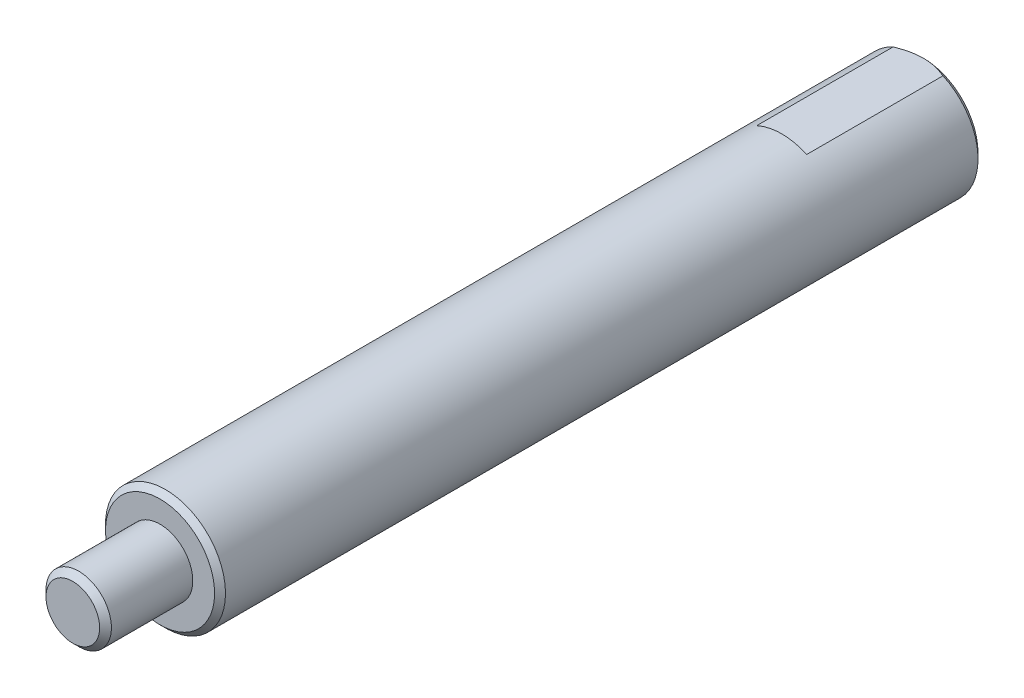
ISO-10303-21;
HEADER;
FILE_DESCRIPTION(('STEP AP214'),'2;1');
FILE_NAME('part.step','',(''),(''),'','','');
FILE_SCHEMA(('AUTOMOTIVE_DESIGN { 1 0 10303 214 1 1 1 1 }'));
ENDSEC;
DATA;
#1=APPLICATION_CONTEXT('core data for automotive mechanical design processes');
#2=APPLICATION_PROTOCOL_DEFINITION('international standard','automotive_design',2000,#1);
#3=PRODUCT_CONTEXT('',#1,'mechanical');
#4=PRODUCT('Part','Part','',(#3));
#5=PRODUCT_RELATED_PRODUCT_CATEGORY('part','',(#4));
#6=PRODUCT_DEFINITION_FORMATION('','',#4);
#7=PRODUCT_DEFINITION_CONTEXT('part definition',#1,'design');
#8=PRODUCT_DEFINITION('design','',#6,#7);
#9=PRODUCT_DEFINITION_SHAPE('','',#8);
#10=(LENGTH_UNIT() NAMED_UNIT(*) SI_UNIT(.MILLI.,.METRE.));
#11=(NAMED_UNIT(*) PLANE_ANGLE_UNIT() SI_UNIT($,.RADIAN.));
#12=(NAMED_UNIT(*) SI_UNIT($,.STERADIAN.) SOLID_ANGLE_UNIT());
#13=UNCERTAINTY_MEASURE_WITH_UNIT(LENGTH_MEASURE(1.E-05),#10,'distance_accuracy_value','');
#14=(GEOMETRIC_REPRESENTATION_CONTEXT(3) GLOBAL_UNCERTAINTY_ASSIGNED_CONTEXT((#13)) GLOBAL_UNIT_ASSIGNED_CONTEXT((#10,
#11,#12)) REPRESENTATION_CONTEXT('',''));
#15=CARTESIAN_POINT('',(0.,0.,0.));
#16=DIRECTION('',(0.,0.,1.));
#17=DIRECTION('',(1.,0.,0.));
#18=AXIS2_PLACEMENT_3D('',#15,#16,#17);
#19=CARTESIAN_POINT('',(0.,0.,0.5));
#20=DIRECTION('',(0.,0.,1.));
#21=DIRECTION('',(1.,0.,0.));
#22=AXIS2_PLACEMENT_3D('',#19,#20,#21);
#23=CONICAL_SURFACE('',#22,5.5,0.785398163397457);
#24=CARTESIAN_POINT('',(14.6848091307527,5.,10.5126921972504));
#25=CARTESIAN_POINT('',(14.4453208226169,5.,10.2859896541326));
#26=CARTESIAN_POINT('',(14.2055496886512,5.,10.0595855916861));
#27=CARTESIAN_POINT('',(13.7253433237667,5.,9.60748006149906));
#28=CARTESIAN_POINT('',(13.4849080888775,5.,9.38177859797622));
#29=CARTESIAN_POINT('',(12.7618962256916,5.,8.70536049882658));
#30=CARTESIAN_POINT('',(12.2781765081116,5.,8.25586410270802));
#31=CARTESIAN_POINT('',(11.285520275484,5.,7.34194274282295));
#32=CARTESIAN_POINT('',(10.7764003173808,5.,6.87771631839147));
#33=CARTESIAN_POINT('',(10.0081237078526,5.,6.18705169530893));
#34=CARTESIAN_POINT('',(9.75140731219676,5.,5.95789999795166));
#35=CARTESIAN_POINT('',(9.23598125315539,5.,5.50185127115898));
#36=CARTESIAN_POINT('',(8.97727160895973,5.,5.27495422006515));
#37=CARTESIAN_POINT('',(8.45777334373333,5.,4.82431921159364));
#38=CARTESIAN_POINT('',(8.19698831207968,5.,4.60057712329841));
#39=CARTESIAN_POINT('',(7.6723358301828,5.,4.15670009726197));
#40=CARTESIAN_POINT('',(7.4084682157494,5.,3.93656535317604));
#41=CARTESIAN_POINT('',(6.87588577364976,5.,3.50025684420232));
#42=CARTESIAN_POINT('',(6.60715699098736,5.,3.28410005066106));
#43=CARTESIAN_POINT('',(6.06467897085506,5.,2.85824880719012));
#44=CARTESIAN_POINT('',(5.79093054202075,5.,2.64855333071791));
#45=CARTESIAN_POINT('',(5.24247824545979,5.,2.24225256251792));
#46=CARTESIAN_POINT('',(4.96790940819435,5.,2.04546689887257));
#47=CARTESIAN_POINT('',(4.54965992503172,5.,1.7593740597509));
#48=CARTESIAN_POINT('',(4.40911425501469,5.,1.66548481679897));
#49=CARTESIAN_POINT('',(4.12560555295639,5.,1.48143277641831));
#50=CARTESIAN_POINT('',(3.98264266122826,5.,1.39126976373138));
#51=CARTESIAN_POINT('',(3.69483138879447,5.,1.21601413329321));
#52=CARTESIAN_POINT('',(3.54999993591857,5.,1.13089382459595));
#53=CARTESIAN_POINT('',(3.25720950323672,5.,0.96613475049896));
#54=CARTESIAN_POINT('',(3.10925012756169,5.,0.886496684424973));
#55=CARTESIAN_POINT('',(2.81011276522673,5.,0.734125373534712));
#56=CARTESIAN_POINT('',(2.65894061859038,5.,0.661380726321601));
#57=CARTESIAN_POINT('',(2.35286256329051,5.,0.524242686166179));
#58=CARTESIAN_POINT('',(2.19795788752428,5.,0.459846579258794));
#59=CARTESIAN_POINT('',(1.96757107505026,5.,0.372774300731281));
#60=CARTESIAN_POINT('',(1.89359074216658,5.,0.346101437024846));
#61=CARTESIAN_POINT('',(1.74478391072042,5.,0.295222264195086));
#62=CARTESIAN_POINT('',(1.66995737392907,5.,0.271016067006701));
#63=CARTESIAN_POINT('',(1.44419485912727,5.,0.202417832217193));
#64=CARTESIAN_POINT('',(1.29200049197909,5.,0.162055560028204));
#65=CARTESIAN_POINT('',(0.985646477349276,5.,0.0940487123556825));
#66=CARTESIAN_POINT('',(0.831502220582615,5.,0.0663354854095938));
#67=CARTESIAN_POINT('',(0.521341182896939,5.,0.0247588689838233));
#68=CARTESIAN_POINT('',(0.365324622092967,5.,0.0108938672889534));
#69=CARTESIAN_POINT('',(0.0516160098073081,5.,-0.00220571628048262));
#70=CARTESIAN_POINT('',(-0.106080254029489,5.,-0.00134130349865995));
#71=CARTESIAN_POINT('',(-0.420679844238093,5.,0.015205502727523));
#72=CARTESIAN_POINT('',(-0.577583163483296,5.,0.0308880291126693));
#73=CARTESIAN_POINT('',(-0.890071145811355,5.,0.0762385891218637));
#74=CARTESIAN_POINT('',(-1.04564624986807,5.,0.105971488681488));
#75=CARTESIAN_POINT('',(-1.35387421816574,5.,0.177884717281074));
#76=CARTESIAN_POINT('',(-1.50652647420601,5.,0.220067607636138));
#77=CARTESIAN_POINT('',(-1.89899228144063,5.,0.343556358459226));
#78=CARTESIAN_POINT('',(-2.13618939052799,5.,0.433155135839447));
#79=CARTESIAN_POINT('',(-2.6019239710927,5.,0.632544932175611));
#80=CARTESIAN_POINT('',(-2.83045405488705,5.,0.742352730382571));
#81=CARTESIAN_POINT('',(-3.16847602424751,5.,0.918609391765351));
#82=CARTESIAN_POINT('',(-3.2808721724946,5.,0.979600606049572));
#83=CARTESIAN_POINT('',(-3.50386518493618,5.,1.10479681410015));
#84=CARTESIAN_POINT('',(-3.61446202600304,5.,1.16900184913261));
#85=CARTESIAN_POINT('',(-3.83396126584146,5.,1.30012039469583));
#86=CARTESIAN_POINT('',(-3.94286443721393,5.,1.36703261693928));
#87=CARTESIAN_POINT('',(-4.15918024646913,5.,1.50320934076179));
#88=CARTESIAN_POINT('',(-4.26659294268127,5.,1.57247374992073));
#89=CARTESIAN_POINT('',(-4.62241235734337,5.,1.80671898738903));
#90=CARTESIAN_POINT('',(-4.8678658700884,5.,1.97619150842323));
#91=CARTESIAN_POINT('',(-5.35312692377588,5.,2.32306349681903));
#92=CARTESIAN_POINT('',(-5.5929332207239,5.,2.50046468625888));
#93=CARTESIAN_POINT('',(-6.06824445724728,5.,2.86127560728381));
#94=CARTESIAN_POINT('',(-6.30374612411163,5.,3.04468963665758));
#95=CARTESIAN_POINT('',(-6.77116765089348,5.,3.41597165684284));
#96=CARTESIAN_POINT('',(-7.00308779793956,5.,3.603839287518));
#97=CARTESIAN_POINT('',(-7.46479831203303,5.,3.98364854892032));
#98=CARTESIAN_POINT('',(-7.69457957218859,5.,4.17560122632358));
#99=CARTESIAN_POINT('',(-8.15180534086184,5.,4.56227258082269));
#100=CARTESIAN_POINT('',(-8.37924980937898,5.,4.7569913051315));
#101=CARTESIAN_POINT('',(-8.83212152767335,5.,5.14856830192789));
#102=CARTESIAN_POINT('',(-9.05754957794687,5.,5.34542564979244));
#103=CARTESIAN_POINT('',(-9.50680949169888,5.,5.74095449633208));
#104=CARTESIAN_POINT('',(-9.73064134364113,5.,5.93962600809511));
#105=CARTESIAN_POINT('',(-10.3554269609871,5.,6.49792304019967));
#106=CARTESIAN_POINT('',(-10.7548894567921,5.,6.85921712232008));
#107=CARTESIAN_POINT('',(-11.5506520435192,5.,7.58535654201278));
#108=CARTESIAN_POINT('',(-11.9469517546505,5.,7.95020229473568));
#109=CARTESIAN_POINT('',(-12.7346046209229,5.,8.6802168794551));
#110=CARTESIAN_POINT('',(-13.1259732089033,5.,9.04536907885113));
#111=CARTESIAN_POINT('',(-13.9067337252459,5.,9.77766414097997));
#112=CARTESIAN_POINT('',(-14.2961259422761,5.,10.1448066957958));
#113=CARTESIAN_POINT('',(-14.6848091307527,5.,10.5126921972504));
#114=B_SPLINE_CURVE_WITH_KNOTS('',3,(#24,#25,#26,#27,#28,#29,#30,#31,#32,#33,#34,#35,#36,#37,
#38,#39,#40,#41,#42,#43,#44,#45,#46,#47,#48,#49,#50,#51,#52,#53,#54,#55,#56,#57,#58,#59,#60,#61,
#62,#63,#64,#65,#66,#67,#68,#69,#70,#71,#72,#73,#74,#75,#76,#77,#78,#79,#80,#81,#82,#83,#84,#85,
#86,#87,#88,#89,#90,#91,#92,#93,#94,#95,#96,#97,#98,#99,#100,#101,#102,#103,#104,#105,#106,#107,
#108,#109,#110,#111,#112,#113),.UNSPECIFIED.,.F.,.F.,(4,2,2,2,2,2,2,2,2,2,2,2,2,2,2,2,2,2,2,2,2,
2,2,2,2,2,2,2,2,2,2,2,2,2,2,2,2,2,2,2,2,2,2,2,4),(0.,0.989311923310725,1.97862977419094,
3.95959337600449,6.02651317448664,7.05884240046679,8.09116170015323,9.12197286482435,
10.1528391870695,11.1873903696084,12.2217763312281,13.2349233326135,13.7419424161501,
14.2489321689687,14.7528143978999,15.2567607843972,15.7598584856993,16.2627922263957,
16.4986794127495,16.7345772986731,17.2064516788898,17.6757336299656,18.1449609407033,
18.6173431093421,19.0897295160002,19.5643184047905,20.0390049980712,20.798297788604,
21.5582238763949,21.9418160729224,22.325413196115,22.7088298733657,23.0922315031285,
23.9868071792125,24.8815781072262,25.7770031658052,26.6723560620085,27.5705534283766,
28.4687661443111,29.3666048627684,30.2644500636282,31.8802558929104,33.4962529155446,
35.1020309687601,36.707567313143),.UNSPECIFIED.);
#115=CARTESIAN_POINT('',(2.29128784747799,5.,0.499999999999981));
#116=VERTEX_POINT('',#115);
#117=CARTESIAN_POINT('',(0.,4.99999999999999,0.));
#118=VERTEX_POINT('',#117);
#119=EDGE_CURVE('E56',#116,#118,#114,.T.);
#120=ORIENTED_EDGE('',*,*,#119,.F.);
#121=CARTESIAN_POINT('',(0.,0.,0.5));
#122=DIRECTION('',(0.,0.,1.));
#123=DIRECTION('',(1.,0.,0.));
#124=AXIS2_PLACEMENT_3D('',#121,#122,#123);
#125=CIRCLE('',#124,5.5);
#126=CARTESIAN_POINT('',(2.29128784747792,-5.,0.5));
#127=VERTEX_POINT('',#126);
#128=EDGE_CURVE('E125',#127,#116,#125,.T.);
#129=ORIENTED_EDGE('',*,*,#128,.F.);
#130=CARTESIAN_POINT('',(-14.6848091307527,-5.,10.5126921972504));
#131=CARTESIAN_POINT('',(-14.4453208226169,-5.,10.2859896541325));
#132=CARTESIAN_POINT('',(-14.2055496886512,-5.,10.0595855916861));
#133=CARTESIAN_POINT('',(-13.7253433237667,-5.,9.60748006149906));
#134=CARTESIAN_POINT('',(-13.4849080888775,-5.,9.38177859797621));
#135=CARTESIAN_POINT('',(-12.7618962256916,-5.,8.70536049882658));
#136=CARTESIAN_POINT('',(-12.2781765081116,-5.,8.25586410270802));
#137=CARTESIAN_POINT('',(-11.285520275484,-5.,7.34194274282294));
#138=CARTESIAN_POINT('',(-10.7764003173808,-5.,6.87771631839147));
#139=CARTESIAN_POINT('',(-10.0081237078526,-5.,6.18705169530893));
#140=CARTESIAN_POINT('',(-9.75140731219676,-5.,5.95789999795166));
#141=CARTESIAN_POINT('',(-9.23598125315539,-5.,5.50185127115898));
#142=CARTESIAN_POINT('',(-8.97727160895972,-5.,5.27495422006515));
#143=CARTESIAN_POINT('',(-8.45777334373333,-5.,4.82431921159363));
#144=CARTESIAN_POINT('',(-8.19698831207968,-5.,4.60057712329841));
#145=CARTESIAN_POINT('',(-7.67233583018279,-5.,4.15670009726197));
#146=CARTESIAN_POINT('',(-7.4084682157494,-5.,3.93656535317604));
#147=CARTESIAN_POINT('',(-6.87588577364976,-5.,3.50025684420232));
#148=CARTESIAN_POINT('',(-6.60715699098736,-5.,3.28410005066106));
#149=CARTESIAN_POINT('',(-6.06467897085506,-5.,2.85824880719012));
#150=CARTESIAN_POINT('',(-5.79093054202075,-5.,2.64855333071791));
#151=CARTESIAN_POINT('',(-5.24247824545979,-5.,2.24225256251792));
#152=CARTESIAN_POINT('',(-4.96790940819436,-5.,2.04546689887257));
#153=CARTESIAN_POINT('',(-4.54965992503172,-5.,1.7593740597509));
#154=CARTESIAN_POINT('',(-4.40911425501469,-5.,1.66548481679897));
#155=CARTESIAN_POINT('',(-4.12560555295639,-5.,1.48143277641831));
#156=CARTESIAN_POINT('',(-3.98264266122826,-5.,1.39126976373138));
#157=CARTESIAN_POINT('',(-3.69483138879447,-5.,1.21601413329321));
#158=CARTESIAN_POINT('',(-3.54999993591857,-5.,1.13089382459595));
#159=CARTESIAN_POINT('',(-3.25720950323672,-5.,0.96613475049896));
#160=CARTESIAN_POINT('',(-3.10925012756169,-5.,0.886496684424973));
#161=CARTESIAN_POINT('',(-2.81011276522673,-5.,0.734125373534712));
#162=CARTESIAN_POINT('',(-2.65894061859038,-5.,0.661380726321601));
#163=CARTESIAN_POINT('',(-2.35286256329051,-5.,0.524242686166179));
#164=CARTESIAN_POINT('',(-2.19795788752428,-5.,0.459846579258795));
#165=CARTESIAN_POINT('',(-1.96757107505027,-5.,0.372774300731282));
#166=CARTESIAN_POINT('',(-1.89359074216658,-5.,0.346101437024846));
#167=CARTESIAN_POINT('',(-1.74478391072042,-5.,0.295222264195086));
#168=CARTESIAN_POINT('',(-1.66995737392907,-5.,0.271016067006701));
#169=CARTESIAN_POINT('',(-1.44419485912727,-5.,0.202417832217193));
#170=CARTESIAN_POINT('',(-1.29200049197909,-5.,0.162055560028204));
#171=CARTESIAN_POINT('',(-0.985646477349277,-5.,0.0940487123556828));
#172=CARTESIAN_POINT('',(-0.831502220582616,-5.,0.0663354854095948));
#173=CARTESIAN_POINT('',(-0.52134118289694,-5.,0.0247588689838242));
#174=CARTESIAN_POINT('',(-0.365324622092969,-5.,0.0108938672889537));
#175=CARTESIAN_POINT('',(-0.0516160098073107,-5.,-0.00220571628048288));
#176=CARTESIAN_POINT('',(0.106080254029486,-5.,-0.00134130349866004));
#177=CARTESIAN_POINT('',(0.42067984423809,-5.,0.0152055027275231));
#178=CARTESIAN_POINT('',(0.577583163483293,-5.,0.0308880291126695));
#179=CARTESIAN_POINT('',(0.890071145811352,-5.,0.0762385891218634));
#180=CARTESIAN_POINT('',(1.04564624986807,-5.,0.105971488681487));
#181=CARTESIAN_POINT('',(1.35387421816574,-5.,0.177884717281073));
#182=CARTESIAN_POINT('',(1.50652647420601,-5.,0.220067607636137));
#183=CARTESIAN_POINT('',(1.89899228144063,-5.,0.343556358459226));
#184=CARTESIAN_POINT('',(2.13618939052798,-5.,0.433155135839446));
#185=CARTESIAN_POINT('',(2.60192397109269,-5.,0.632544932175609));
#186=CARTESIAN_POINT('',(2.83045405488705,-5.,0.742352730382567));
#187=CARTESIAN_POINT('',(3.1684760242475,-5.,0.918609391765348));
#188=CARTESIAN_POINT('',(3.28087217249459,-5.,0.97960060604957));
#189=CARTESIAN_POINT('',(3.50386518493617,-5.,1.10479681410015));
#190=CARTESIAN_POINT('',(3.61446202600303,-5.,1.16900184913261));
#191=CARTESIAN_POINT('',(3.83396126584145,-5.,1.30012039469583));
#192=CARTESIAN_POINT('',(3.94286443721392,-5.,1.36703261693928));
#193=CARTESIAN_POINT('',(4.15918024646912,-5.,1.50320934076178));
#194=CARTESIAN_POINT('',(4.26659294268127,-5.,1.57247374992073));
#195=CARTESIAN_POINT('',(4.62241235734336,-5.,1.80671898738902));
#196=CARTESIAN_POINT('',(4.86786587008839,-5.,1.97619150842322));
#197=CARTESIAN_POINT('',(5.35312692377587,-5.,2.32306349681902));
#198=CARTESIAN_POINT('',(5.59293322072389,-5.,2.50046468625887));
#199=CARTESIAN_POINT('',(6.06824445724727,-5.,2.86127560728381));
#200=CARTESIAN_POINT('',(6.30374612411162,-5.,3.04468963665757));
#201=CARTESIAN_POINT('',(6.77116765089347,-5.,3.41597165684283));
#202=CARTESIAN_POINT('',(7.00308779793955,-5.,3.60383928751799));
#203=CARTESIAN_POINT('',(7.46479831203302,-5.,3.98364854892032));
#204=CARTESIAN_POINT('',(7.69457957218858,-5.,4.17560122632357));
#205=CARTESIAN_POINT('',(8.15180534086183,-5.,4.56227258082269));
#206=CARTESIAN_POINT('',(8.37924980937897,-5.,4.75699130513149));
#207=CARTESIAN_POINT('',(8.83212152767334,-5.,5.14856830192789));
#208=CARTESIAN_POINT('',(9.05754957794686,-5.,5.34542564979243));
#209=CARTESIAN_POINT('',(9.50680949169887,-5.,5.74095449633208));
#210=CARTESIAN_POINT('',(9.73064134364113,-5.,5.9396260080951));
#211=CARTESIAN_POINT('',(10.355426960987,-5.,6.49792304019967));
#212=CARTESIAN_POINT('',(10.7548894567921,-5.,6.85921712232007));
#213=CARTESIAN_POINT('',(11.5506520435192,-5.,7.58535654201278));
#214=CARTESIAN_POINT('',(11.9469517546505,-5.,7.95020229473567));
#215=CARTESIAN_POINT('',(12.7346046209229,-5.,8.6802168794551));
#216=CARTESIAN_POINT('',(13.1259732089033,-5.,9.04536907885113));
#217=CARTESIAN_POINT('',(13.9067337252459,-5.,9.77766414097997));
#218=CARTESIAN_POINT('',(14.2961259422761,-5.,10.1448066957958));
#219=CARTESIAN_POINT('',(14.6848091307527,-5.,10.5126921972504));
#220=B_SPLINE_CURVE_WITH_KNOTS('',3,(#130,#131,#132,#133,#134,#135,#136,#137,#138,#139,#140,
#141,#142,#143,#144,#145,#146,#147,#148,#149,#150,#151,#152,#153,#154,#155,#156,#157,#158,#159,
#160,#161,#162,#163,#164,#165,#166,#167,#168,#169,#170,#171,#172,#173,#174,#175,#176,#177,#178,
#179,#180,#181,#182,#183,#184,#185,#186,#187,#188,#189,#190,#191,#192,#193,#194,#195,#196,#197,
#198,#199,#200,#201,#202,#203,#204,#205,#206,#207,#208,#209,#210,#211,#212,#213,#214,#215,#216,
#217,#218,#219),.UNSPECIFIED.,.F.,.F.,(4,2,2,2,2,2,2,2,2,2,2,2,2,2,2,2,2,2,2,2,2,2,2,2,2,2,2,2,
2,2,2,2,2,2,2,2,2,2,2,2,2,2,2,2,4),(0.,0.989311923310724,1.97862977419094,3.95959337600449,
6.02651317448663,7.05884240046678,8.09116170015323,9.12197286482434,10.1528391870695,
11.1873903696084,12.2217763312281,13.2349233326135,13.7419424161501,14.2489321689687,
14.7528143978999,15.2567607843972,15.7598584856993,16.2627922263957,16.4986794127495,
16.7345772986731,17.2064516788898,17.6757336299656,18.1449609407033,18.6173431093421,
19.0897295160002,19.5643184047905,20.0390049980712,20.798297788604,21.5582238763948,
21.9418160729224,22.325413196115,22.7088298733657,23.0922315031285,23.9868071792125,
24.8815781072262,25.7770031658052,26.6723560620085,27.5705534283765,28.468766144311,
29.3666048627684,30.2644500636281,31.8802558929104,33.4962529155446,35.10203096876,
36.7075673131429),.UNSPECIFIED.);
#221=CARTESIAN_POINT('',(0.,-4.99999999999999,0.));
#222=VERTEX_POINT('',#221);
#223=EDGE_CURVE('E141',#222,#127,#220,.T.);
#224=ORIENTED_EDGE('',*,*,#223,.F.);
#225=CARTESIAN_POINT('',(0.,0.,0.));
#226=DIRECTION('',(0.,0.,1.));
#227=DIRECTION('',(1.,0.,0.));
#228=AXIS2_PLACEMENT_3D('',#225,#226,#227);
#229=CIRCLE('',#228,4.99999999999999);
#230=EDGE_CURVE('E132',#118,#222,#229,.F.);
#231=ORIENTED_EDGE('',*,*,#230,.F.);
#232=EDGE_LOOP('',(#120,#129,#224,#231));
#233=FACE_BOUND('',#232,.T.);
#234=ADVANCED_FACE('F41',(#233),#23,.T.);
#235=CARTESIAN_POINT('',(0.,0.,70.));
#236=DIRECTION('',(0.,0.,1.));
#237=DIRECTION('',(1.,0.,0.));
#238=AXIS2_PLACEMENT_3D('',#235,#236,#237);
#239=PLANE('',#238);
#240=CARTESIAN_POINT('',(0.,0.,70.));
#241=DIRECTION('',(0.,0.,1.));
#242=DIRECTION('',(1.,0.,0.));
#243=AXIS2_PLACEMENT_3D('',#240,#241,#242);
#244=CIRCLE('',#243,5.);
#245=CARTESIAN_POINT('',(5.,0.,70.));
#246=VERTEX_POINT('',#245);
#247=EDGE_CURVE('E131',#246,#246,#244,.T.);
#248=ORIENTED_EDGE('',*,*,#247,.T.);
#249=EDGE_LOOP('',(#248));
#250=FACE_BOUND('',#249,.T.);
#251=CARTESIAN_POINT('',(0.,0.,70.));
#252=DIRECTION('',(0.,0.,-1.));
#253=DIRECTION('',(-1.,0.,0.));
#254=AXIS2_PLACEMENT_3D('',#251,#252,#253);
#255=CIRCLE('',#254,3.);
#256=CARTESIAN_POINT('',(-3.,0.,70.));
#257=VERTEX_POINT('',#256);
#258=EDGE_CURVE('E100',#257,#257,#255,.T.);
#259=ORIENTED_EDGE('',*,*,#258,.T.);
#260=EDGE_LOOP('',(#259));
#261=FACE_BOUND('',#260,.T.);
#262=ADVANCED_FACE('F177',(#250,#261),#239,.T.);
#263=CARTESIAN_POINT('',(0.,0.,70.));
#264=DIRECTION('',(0.,0.,-1.));
#265=DIRECTION('',(-1.,0.,0.));
#266=AXIS2_PLACEMENT_3D('',#263,#264,#265);
#267=CYLINDRICAL_SURFACE('',#266,5.5);
#268=CARTESIAN_POINT('',(0.,0.,13.));
#269=DIRECTION('',(0.,0.,-1.));
#270=DIRECTION('',(-1.,0.,0.));
#271=AXIS2_PLACEMENT_3D('',#268,#269,#270);
#272=CIRCLE('',#271,5.5);
#273=CARTESIAN_POINT('',(-2.29128784747792,5.,13.));
#274=VERTEX_POINT('',#273);
#275=CARTESIAN_POINT('',(2.29128784747792,5.,13.));
#276=VERTEX_POINT('',#275);
#277=EDGE_CURVE('E11',#274,#276,#272,.T.);
#278=ORIENTED_EDGE('',*,*,#277,.F.);
#279=DIRECTION('',(0.,0.,-1.));
#280=VECTOR('',#279,1.);
#281=CARTESIAN_POINT('',(-2.29128784747792,5.,70.));
#282=LINE('',#281,#280);
#283=CARTESIAN_POINT('',(-2.29128784747792,5.,0.5));
#284=VERTEX_POINT('',#283);
#285=EDGE_CURVE('E117',#274,#284,#282,.T.);
#286=ORIENTED_EDGE('',*,*,#285,.T.);
#287=CARTESIAN_POINT('',(-2.29128784747799,-5.,0.499999999999981));
#288=VERTEX_POINT('',#287);
#289=EDGE_CURVE('E108',#284,#288,#125,.T.);
#290=ORIENTED_EDGE('',*,*,#289,.T.);
#291=DIRECTION('',(0.,0.,-1.));
#292=VECTOR('',#291,1.);
#293=CARTESIAN_POINT('',(-2.29128784747792,-5.,70.));
#294=LINE('',#293,#292);
#295=CARTESIAN_POINT('',(-2.29128784747792,-5.,13.));
#296=VERTEX_POINT('',#295);
#297=EDGE_CURVE('E97',#288,#296,#294,.F.);
#298=ORIENTED_EDGE('',*,*,#297,.T.);
#299=CARTESIAN_POINT('',(0.,0.,13.));
#300=DIRECTION('',(0.,0.,1.));
#301=DIRECTION('',(1.,0.,0.));
#302=AXIS2_PLACEMENT_3D('',#299,#300,#301);
#303=CIRCLE('',#302,5.5);
#304=CARTESIAN_POINT('',(2.29128784747792,-5.,13.));
#305=VERTEX_POINT('',#304);
#306=EDGE_CURVE('E49',#296,#305,#303,.T.);
#307=ORIENTED_EDGE('',*,*,#306,.T.);
#308=DIRECTION('',(0.,0.,-1.));
#309=VECTOR('',#308,1.);
#310=CARTESIAN_POINT('',(2.29128784747792,-5.,70.));
#311=LINE('',#310,#309);
#312=EDGE_CURVE('E98',#305,#127,#311,.T.);
#313=ORIENTED_EDGE('',*,*,#312,.T.);
#314=ORIENTED_EDGE('',*,*,#128,.T.);
#315=DIRECTION('',(0.,0.,-1.));
#316=VECTOR('',#315,1.);
#317=CARTESIAN_POINT('',(2.29128784747792,5.,70.));
#318=LINE('',#317,#316);
#319=EDGE_CURVE('E110',#116,#276,#318,.F.);
#320=ORIENTED_EDGE('',*,*,#319,.T.);
#321=EDGE_LOOP('',(#278,#286,#290,#298,#307,#313,#314,#320));
#322=FACE_BOUND('',#321,.T.);
#323=CARTESIAN_POINT('',(0.,0.,69.5));
#324=DIRECTION('',(0.,0.,1.));
#325=DIRECTION('',(1.,0.,0.));
#326=AXIS2_PLACEMENT_3D('',#323,#324,#325);
#327=CIRCLE('',#326,5.5);
#328=CARTESIAN_POINT('',(5.5,0.,69.5));
#329=VERTEX_POINT('',#328);
#330=EDGE_CURVE('E122',#329,#329,#327,.F.);
#331=ORIENTED_EDGE('',*,*,#330,.T.);
#332=EDGE_LOOP('',(#331));
#333=FACE_BOUND('',#332,.T.);
#334=ADVANCED_FACE('F104',(#322,#333),#267,.T.);
#335=CARTESIAN_POINT('',(0.,0.,0.));
#336=DIRECTION('',(0.,0.,1.));
#337=DIRECTION('',(1.,0.,0.));
#338=AXIS2_PLACEMENT_3D('',#335,#336,#337);
#339=PLANE('',#338);
#340=CARTESIAN_POINT('',(0.,0.,0.));
#341=DIRECTION('',(0.,0.,1.));
#342=DIRECTION('',(1.,0.,0.));
#343=AXIS2_PLACEMENT_3D('',#340,#341,#342);
#344=CIRCLE('',#343,2.6);
#345=CARTESIAN_POINT('',(2.6,0.,0.));
#346=VERTEX_POINT('',#345);
#347=EDGE_CURVE('E138',#346,#346,#344,.T.);
#348=ORIENTED_EDGE('',*,*,#347,.T.);
#349=EDGE_LOOP('',(#348));
#350=FACE_BOUND('',#349,.T.);
#351=EDGE_CURVE('E128',#222,#118,#229,.F.);
#352=ORIENTED_EDGE('',*,*,#351,.T.);
#353=ORIENTED_EDGE('',*,*,#230,.T.);
#354=EDGE_LOOP('',(#352,#353));
#355=FACE_BOUND('',#354,.T.);
#356=ADVANCED_FACE('F181',(#350,#355),#339,.F.);
#357=EDGE_CURVE('E149',#118,#284,#114,.T.);
#358=ORIENTED_EDGE('',*,*,#357,.F.);
#359=ORIENTED_EDGE('',*,*,#351,.F.);
#360=EDGE_CURVE('E64',#288,#222,#220,.T.);
#361=ORIENTED_EDGE('',*,*,#360,.F.);
#362=ORIENTED_EDGE('',*,*,#289,.F.);
#363=EDGE_LOOP('',(#358,#359,#361,#362));
#364=FACE_BOUND('',#363,.T.);
#365=ADVANCED_FACE('F155',(#364),#23,.T.);
#366=CARTESIAN_POINT('',(0.,0.,70.));
#367=DIRECTION('',(0.,0.,-1.));
#368=DIRECTION('',(-1.,0.,0.));
#369=AXIS2_PLACEMENT_3D('',#366,#367,#368);
#370=CONICAL_SURFACE('',#369,5.,0.785398163397436);
#371=ORIENTED_EDGE('',*,*,#330,.F.);
#372=EDGE_LOOP('',(#371));
#373=FACE_BOUND('',#372,.T.);
#374=ORIENTED_EDGE('',*,*,#247,.F.);
#375=EDGE_LOOP('',(#374));
#376=FACE_BOUND('',#375,.T.);
#377=ADVANCED_FACE('F170',(#373,#376),#370,.T.);
#378=CARTESIAN_POINT('',(0.,0.,12.4));
#379=DIRECTION('',(0.,0.,-1.));
#380=DIRECTION('',(-1.,0.,0.));
#381=AXIS2_PLACEMENT_3D('',#378,#379,#380);
#382=CONICAL_SURFACE('',#381,2.1,1.02974425867665);
#383=CARTESIAN_POINT('',(0.,0.,13.6618072999579));
#384=VERTEX_POINT('',#383);
#385=VERTEX_LOOP('',#384);
#386=FACE_BOUND('',#385,.T.);
#387=CARTESIAN_POINT('',(0.,0.,12.4));
#388=DIRECTION('',(0.,0.,-1.));
#389=DIRECTION('',(-1.,0.,0.));
#390=AXIS2_PLACEMENT_3D('',#387,#388,#389);
#391=CIRCLE('',#390,2.1);
#392=CARTESIAN_POINT('',(-2.1,0.,12.4));
#393=VERTEX_POINT('',#392);
#394=EDGE_CURVE('E119',#393,#393,#391,.T.);
#395=ORIENTED_EDGE('',*,*,#394,.T.);
#396=EDGE_LOOP('',(#395));
#397=FACE_BOUND('',#396,.T.);
#398=ADVANCED_FACE('F166',(#386,#397),#382,.F.);
#399=CARTESIAN_POINT('',(0.,0.,0.));
#400=DIRECTION('',(0.,0.,-1.));
#401=DIRECTION('',(-1.,0.,0.));
#402=AXIS2_PLACEMENT_3D('',#399,#400,#401);
#403=CYLINDRICAL_SURFACE('',#402,2.1);
#404=CARTESIAN_POINT('',(0.,0.,0.500000000000007));
#405=DIRECTION('',(0.,0.,1.));
#406=DIRECTION('',(1.,0.,0.));
#407=AXIS2_PLACEMENT_3D('',#404,#405,#406);
#408=CIRCLE('',#407,2.1);
#409=CARTESIAN_POINT('',(2.1,0.,0.500000000000007));
#410=VERTEX_POINT('',#409);
#411=EDGE_CURVE('E135',#410,#410,#408,.F.);
#412=ORIENTED_EDGE('',*,*,#411,.T.);
#413=EDGE_LOOP('',(#412));
#414=FACE_BOUND('',#413,.T.);
#415=ORIENTED_EDGE('',*,*,#394,.F.);
#416=EDGE_LOOP('',(#415));
#417=FACE_BOUND('',#416,.T.);
#418=ADVANCED_FACE('F163',(#414,#417),#403,.F.);
#419=CARTESIAN_POINT('',(0.,0.,0.500000000000007));
#420=DIRECTION('',(0.,0.,-1.));
#421=DIRECTION('',(-1.,0.,0.));
#422=AXIS2_PLACEMENT_3D('',#419,#420,#421);
#423=CONICAL_SURFACE('',#422,2.1,0.785398163397448);
#424=ORIENTED_EDGE('',*,*,#347,.F.);
#425=EDGE_LOOP('',(#424));
#426=FACE_BOUND('',#425,.T.);
#427=ORIENTED_EDGE('',*,*,#411,.F.);
#428=EDGE_LOOP('',(#427));
#429=FACE_BOUND('',#428,.T.);
#430=ADVANCED_FACE('F43',(#426,#429),#423,.F.);
#431=CARTESIAN_POINT('',(0.,0.,13.));
#432=DIRECTION('',(0.,0.,1.));
#433=DIRECTION('',(1.,0.,0.));
#434=AXIS2_PLACEMENT_3D('',#431,#432,#433);
#435=PLANE('',#434);
#436=DIRECTION('',(1.,0.,0.));
#437=VECTOR('',#436,1.);
#438=CARTESIAN_POINT('',(5.,-5.,13.));
#439=LINE('',#438,#437);
#440=EDGE_CURVE('E92',#296,#305,#439,.T.);
#441=ORIENTED_EDGE('',*,*,#440,.T.);
#442=ORIENTED_EDGE('',*,*,#306,.F.);
#443=EDGE_LOOP('',(#441,#442));
#444=FACE_BOUND('',#443,.T.);
#445=ADVANCED_FACE('F91',(#444),#435,.F.);
#446=CARTESIAN_POINT('',(5.,-5.,13.));
#447=DIRECTION('',(0.,1.,0.));
#448=DIRECTION('',(0.,0.,1.));
#449=AXIS2_PLACEMENT_3D('',#446,#447,#448);
#450=PLANE('',#449);
#451=ORIENTED_EDGE('',*,*,#440,.F.);
#452=ORIENTED_EDGE('',*,*,#297,.F.);
#453=ORIENTED_EDGE('',*,*,#360,.T.);
#454=ORIENTED_EDGE('',*,*,#223,.T.);
#455=ORIENTED_EDGE('',*,*,#312,.F.);
#456=EDGE_LOOP('',(#451,#452,#453,#454,#455));
#457=FACE_BOUND('',#456,.T.);
#458=ADVANCED_FACE('F96',(#457),#450,.F.);
#459=CARTESIAN_POINT('',(0.,0.,13.));
#460=DIRECTION('',(0.,0.,-1.));
#461=DIRECTION('',(-1.,0.,0.));
#462=AXIS2_PLACEMENT_3D('',#459,#460,#461);
#463=PLANE('',#462);
#464=ORIENTED_EDGE('',*,*,#277,.T.);
#465=DIRECTION('',(-1.,0.,0.));
#466=VECTOR('',#465,1.);
#467=CARTESIAN_POINT('',(5.,5.,13.));
#468=LINE('',#467,#466);
#469=EDGE_CURVE('E99',#276,#274,#468,.T.);
#470=ORIENTED_EDGE('',*,*,#469,.T.);
#471=EDGE_LOOP('',(#464,#470));
#472=FACE_BOUND('',#471,.T.);
#473=ADVANCED_FACE('F162',(#472),#463,.T.);
#474=CARTESIAN_POINT('',(5.,5.,13.));
#475=DIRECTION('',(0.,-1.,0.));
#476=DIRECTION('',(0.,0.,-1.));
#477=AXIS2_PLACEMENT_3D('',#474,#475,#476);
#478=PLANE('',#477);
#479=ORIENTED_EDGE('',*,*,#469,.F.);
#480=ORIENTED_EDGE('',*,*,#319,.F.);
#481=ORIENTED_EDGE('',*,*,#119,.T.);
#482=ORIENTED_EDGE('',*,*,#357,.T.);
#483=ORIENTED_EDGE('',*,*,#285,.F.);
#484=EDGE_LOOP('',(#479,#480,#481,#482,#483));
#485=FACE_BOUND('',#484,.T.);
#486=ADVANCED_FACE('F203',(#485),#478,.F.);
#487=CARTESIAN_POINT('',(0.,0.,78.));
#488=DIRECTION('',(0.,0.,-1.));
#489=DIRECTION('',(-1.,0.,0.));
#490=AXIS2_PLACEMENT_3D('',#487,#488,#489);
#491=CYLINDRICAL_SURFACE('',#490,3.);
#492=ORIENTED_EDGE('',*,*,#258,.F.);
#493=EDGE_LOOP('',(#492));
#494=FACE_BOUND('',#493,.T.);
#495=CARTESIAN_POINT('',(0.,0.,77.4585));
#496=DIRECTION('',(0.,0.,-1.));
#497=DIRECTION('',(-1.,0.,0.));
#498=AXIS2_PLACEMENT_3D('',#495,#496,#497);
#499=CIRCLE('',#498,3.);
#500=CARTESIAN_POINT('',(-3.,0.,77.4585));
#501=VERTEX_POINT('',#500);
#502=EDGE_CURVE('E223',#501,#501,#499,.T.);
#503=ORIENTED_EDGE('',*,*,#502,.T.);
#504=EDGE_LOOP('',(#503));
#505=FACE_BOUND('',#504,.T.);
#506=ADVANCED_FACE('F210',(#494,#505),#491,.T.);
#507=CARTESIAN_POINT('',(0.,0.,78.));
#508=DIRECTION('',(0.,0.,-1.));
#509=DIRECTION('',(-1.,0.,0.));
#510=AXIS2_PLACEMENT_3D('',#507,#508,#509);
#511=CONICAL_SURFACE('',#510,2.4585,0.785398163397448);
#512=ORIENTED_EDGE('',*,*,#502,.F.);
#513=EDGE_LOOP('',(#512));
#514=FACE_BOUND('',#513,.T.);
#515=CARTESIAN_POINT('',(0.,0.,78.));
#516=DIRECTION('',(0.,0.,-1.));
#517=DIRECTION('',(-1.,0.,0.));
#518=AXIS2_PLACEMENT_3D('',#515,#516,#517);
#519=CIRCLE('',#518,2.4585);
#520=CARTESIAN_POINT('',(-2.4585,0.,78.));
#521=VERTEX_POINT('',#520);
#522=EDGE_CURVE('E226',#521,#521,#519,.T.);
#523=ORIENTED_EDGE('',*,*,#522,.T.);
#524=EDGE_LOOP('',(#523));
#525=FACE_BOUND('',#524,.T.);
#526=ADVANCED_FACE('F175',(#514,#525),#511,.T.);
#527=CARTESIAN_POINT('',(0.,0.,78.));
#528=DIRECTION('',(0.,0.,1.));
#529=DIRECTION('',(1.,0.,0.));
#530=AXIS2_PLACEMENT_3D('',#527,#528,#529);
#531=PLANE('',#530);
#532=ORIENTED_EDGE('',*,*,#522,.F.);
#533=EDGE_LOOP('',(#532));
#534=FACE_BOUND('',#533,.T.);
#535=ADVANCED_FACE('F172',(#534),#531,.T.);
#536=CLOSED_SHELL('',(#234,#262,#334,#356,#365,#377,#398,#418,#430,#445,#458,#473,#486,#506,
#526,#535));
#537=MANIFOLD_SOLID_BREP('B2',#536);
#538=ADVANCED_BREP_SHAPE_REPRESENTATION('',(#18,#537),#14);
#539=SHAPE_DEFINITION_REPRESENTATION(#9,#538);
ENDSEC;
END-ISO-10303-21;
